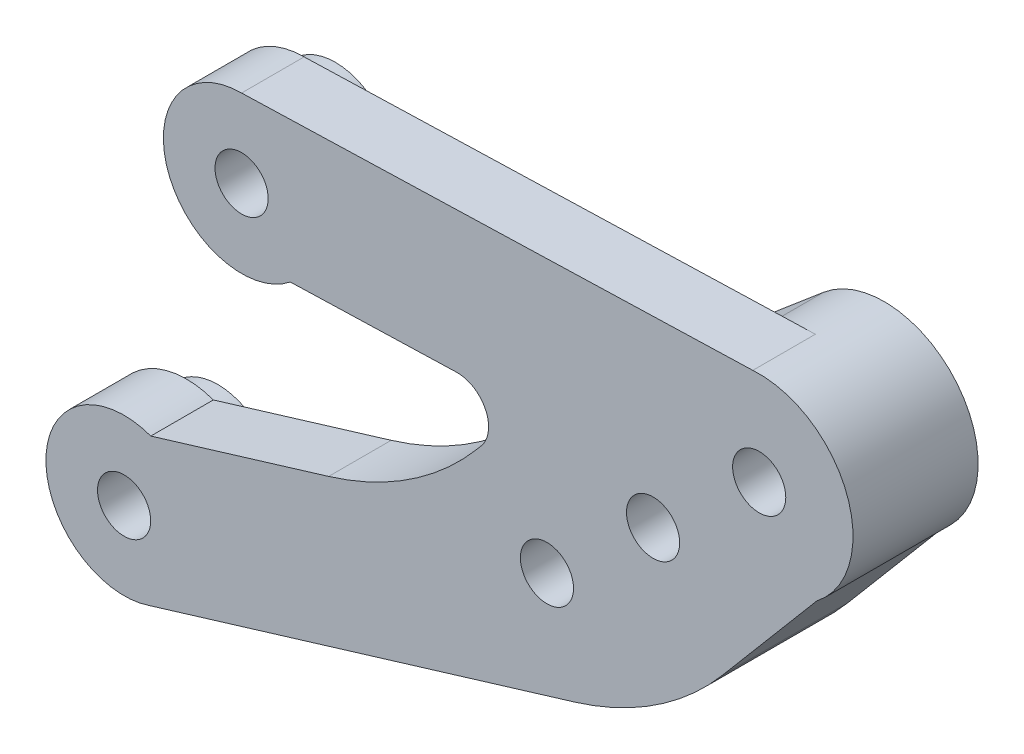
ISO-10303-21;
HEADER;
FILE_DESCRIPTION(('STEP AP214'),'2;1');
FILE_NAME('part.step','',(''),(''),'','','');
FILE_SCHEMA(('AUTOMOTIVE_DESIGN { 1 0 10303 214 1 1 1 1 }'));
ENDSEC;
DATA;
#1=APPLICATION_CONTEXT('core data for automotive mechanical design processes');
#2=APPLICATION_PROTOCOL_DEFINITION('international standard','automotive_design',2000,#1);
#3=PRODUCT_CONTEXT('',#1,'mechanical');
#4=PRODUCT('Part','Part','',(#3));
#5=PRODUCT_RELATED_PRODUCT_CATEGORY('part','',(#4));
#6=PRODUCT_DEFINITION_FORMATION('','',#4);
#7=PRODUCT_DEFINITION_CONTEXT('part definition',#1,'design');
#8=PRODUCT_DEFINITION('design','',#6,#7);
#9=PRODUCT_DEFINITION_SHAPE('','',#8);
#10=(LENGTH_UNIT() NAMED_UNIT(*) SI_UNIT(.MILLI.,.METRE.));
#11=(NAMED_UNIT(*) PLANE_ANGLE_UNIT() SI_UNIT($,.RADIAN.));
#12=(NAMED_UNIT(*) SI_UNIT($,.STERADIAN.) SOLID_ANGLE_UNIT());
#13=UNCERTAINTY_MEASURE_WITH_UNIT(LENGTH_MEASURE(1.E-05),#10,'distance_accuracy_value','');
#14=(GEOMETRIC_REPRESENTATION_CONTEXT(3) GLOBAL_UNCERTAINTY_ASSIGNED_CONTEXT((#13)) GLOBAL_UNIT_ASSIGNED_CONTEXT((#10,
#11,#12)) REPRESENTATION_CONTEXT('',''));
#15=CARTESIAN_POINT('',(0.,0.,0.));
#16=DIRECTION('',(0.,0.,1.));
#17=DIRECTION('',(1.,0.,0.));
#18=AXIS2_PLACEMENT_3D('',#15,#16,#17);
#19=CARTESIAN_POINT('',(0.,0.,-2.));
#20=DIRECTION('',(0.,0.,1.));
#21=DIRECTION('',(1.,0.,0.));
#22=AXIS2_PLACEMENT_3D('',#19,#20,#21);
#23=PLANE('',#22);
#24=CARTESIAN_POINT('',(26.9360632309097,9.68603359319531,-2.));
#25=DIRECTION('',(0.,0.,-1.));
#26=DIRECTION('',(-1.,0.,0.));
#27=AXIS2_PLACEMENT_3D('',#24,#25,#26);
#28=CIRCLE('',#27,6.44539896497374);
#29=CARTESIAN_POINT('',(28.8076552815149,3.5183508019198,-2.));
#30=VERTEX_POINT('',#29);
#31=CARTESIAN_POINT('',(21.6839891931415,13.4221928670333,-2.));
#32=VERTEX_POINT('',#31);
#33=EDGE_CURVE('E179',#30,#32,#28,.T.);
#34=ORIENTED_EDGE('',*,*,#33,.F.);
#35=DIRECTION('',(0.956912492894943,0.290376446947038,0.));
#36=VECTOR('',#35,1.);
#37=CARTESIAN_POINT('',(1.45139171596717,-4.78294599887616,-2.));
#38=LINE('',#37,#36);
#39=CARTESIAN_POINT('',(1.57575227360064,-4.74520861208887,-2.));
#40=VERTEX_POINT('',#39);
#41=EDGE_CURVE('E273',#40,#30,#38,.T.);
#42=ORIENTED_EDGE('',*,*,#41,.F.);
#43=CARTESIAN_POINT('',(0.,0.,-2.));
#44=DIRECTION('',(0.,0.,1.));
#45=DIRECTION('',(1.,0.,0.));
#46=AXIS2_PLACEMENT_3D('',#43,#44,#45);
#47=CIRCLE('',#46,5.);
#48=CARTESIAN_POINT('',(1.70658461953951,4.69974136909162,-2.));
#49=VERTEX_POINT('',#48);
#50=EDGE_CURVE('E269',#49,#40,#47,.T.);
#51=ORIENTED_EDGE('',*,*,#50,.F.);
#52=DIRECTION('',(-0.956912492894943,-0.290376446947038,0.));
#53=VECTOR('',#52,1.);
#54=CARTESIAN_POINT('',(-1.16199630655618,3.82926643717832,-2.));
#55=LINE('',#54,#53);
#56=CARTESIAN_POINT('',(13.0793967045248,8.15083725252361,-2.));
#57=VERTEX_POINT('',#56);
#58=EDGE_CURVE('E266',#57,#49,#55,.T.);
#59=ORIENTED_EDGE('',*,*,#58,.F.);
#60=CARTESIAN_POINT('',(7.27186776558407,27.2890871104225,-2.));
#61=DIRECTION('',(0.,0.,1.));
#62=DIRECTION('',(1.,0.,0.));
#63=AXIS2_PLACEMENT_3D('',#60,#61,#62);
#64=CIRCLE('',#63,20.);
#65=EDGE_CURVE('E311',#57,#32,#64,.T.);
#66=ORIENTED_EDGE('',*,*,#65,.T.);
#67=EDGE_LOOP('',(#34,#42,#51,#59,#66));
#68=FACE_BOUND('',#67,.T.);
#69=CARTESIAN_POINT('',(0.,0.,-2.));
#70=DIRECTION('',(0.,0.,1.));
#71=DIRECTION('',(1.,0.,0.));
#72=AXIS2_PLACEMENT_3D('',#69,#70,#71);
#73=CIRCLE('',#72,3.7);
#74=CARTESIAN_POINT('',(3.7,0.,-2.));
#75=VERTEX_POINT('',#74);
#76=EDGE_CURVE('E318',#75,#75,#73,.F.);
#77=ORIENTED_EDGE('',*,*,#76,.F.);
#78=EDGE_LOOP('',(#77));
#79=FACE_BOUND('',#78,.T.);
#80=ADVANCED_FACE('F41',(#68,#79),#23,.F.);
#81=CARTESIAN_POINT('',(40.6128867069486,21.6007739057783,-2.));
#82=DIRECTION('',(0.,0.,-1.));
#83=DIRECTION('',(-1.,0.,0.));
#84=AXIS2_PLACEMENT_3D('',#81,#82,#83);
#85=CIRCLE('',#84,6.);
#86=CARTESIAN_POINT('',(36.7334177781984,26.1778604060383,-2.));
#87=VERTEX_POINT('',#86);
#88=CARTESIAN_POINT('',(40.203783053973,27.5868105078317,-2.));
#89=VERTEX_POINT('',#88);
#90=EDGE_CURVE('E193',#87,#89,#85,.T.);
#91=ORIENTED_EDGE('',*,*,#90,.F.);
#92=DIRECTION('',(0.762847733091093,0.646578174792329,0.));
#93=VECTOR('',#92,1.);
#94=CARTESIAN_POINT('',(36.7334177781984,26.1778604060383,-2.));
#95=LINE('',#94,#93);
#96=EDGE_CURVE('E175',#32,#87,#95,.T.);
#97=ORIENTED_EDGE('',*,*,#96,.F.);
#98=CARTESIAN_POINT('',(22.5414357724455,14.3724198590053,-2.));
#99=VERTEX_POINT('',#98);
#100=EDGE_CURVE('E310',#32,#99,#64,.T.);
#101=ORIENTED_EDGE('',*,*,#100,.T.);
#102=DIRECTION('',(-0.645833362570859,-0.763478400343073,0.));
#103=VECTOR('',#102,1.);
#104=CARTESIAN_POINT('',(6.0526361731001,-5.11998030374497,-2.));
#105=LINE('',#104,#103);
#106=CARTESIAN_POINT('',(22.8356424846143,14.7202192806435,-2.));
#107=VERTEX_POINT('',#106);
#108=EDGE_CURVE('E263',#107,#99,#105,.T.);
#109=ORIENTED_EDGE('',*,*,#108,.F.);
#110=CARTESIAN_POINT('',(21.3086856839282,16.0118860057853,-2.));
#111=DIRECTION('',(0.,0.,1.));
#112=DIRECTION('',(1.,0.,0.));
#113=AXIS2_PLACEMENT_3D('',#110,#111,#112);
#114=CIRCLE('',#113,2.);
#115=CARTESIAN_POINT('',(21.248388262694,18.0109768543943,-2.));
#116=VERTEX_POINT('',#115);
#117=EDGE_CURVE('E11',#107,#116,#114,.T.);
#118=ORIENTED_EDGE('',*,*,#117,.T.);
#119=DIRECTION('',(0.999545424304533,0.0301487106170736,0.));
#120=VECTOR('',#119,1.);
#121=CARTESIAN_POINT('',(-0.523447280000722,17.3542855691174,-2.));
#122=LINE('',#121,#120);
#123=CARTESIAN_POINT('',(10.6291548266564,17.6906750571438,-2.));
#124=VERTEX_POINT('',#123);
#125=EDGE_CURVE('E259',#124,#116,#122,.T.);
#126=ORIENTED_EDGE('',*,*,#125,.F.);
#127=CARTESIAN_POINT('',(7.51288670694863,21.6007739057783,-2.));
#128=DIRECTION('',(0.,0.,1.));
#129=DIRECTION('',(1.,0.,0.));
#130=AXIS2_PLACEMENT_3D('',#127,#128,#129);
#131=CIRCLE('',#130,5.);
#132=CARTESIAN_POINT('',(7.51288670694863,26.6007739057783,-2.));
#133=VERTEX_POINT('',#132);
#134=EDGE_CURVE('E255',#133,#124,#131,.T.);
#135=ORIENTED_EDGE('',*,*,#134,.F.);
#136=DIRECTION('',(0.999545424304533,0.0301487106170735,0.));
#137=VECTOR('',#136,1.);
#138=CARTESIAN_POINT('',(-0.794785675554382,26.3501943878582,-2.));
#139=LINE('',#138,#137);
#140=EDGE_CURVE('E252',#133,#89,#139,.T.);
#141=ORIENTED_EDGE('',*,*,#140,.T.);
#142=EDGE_LOOP('',(#91,#97,#101,#109,#118,#126,#135,#141));
#143=FACE_BOUND('',#142,.T.);
#144=CARTESIAN_POINT('',(7.51288670694863,21.6007739057783,-2.));
#145=DIRECTION('',(0.,0.,1.));
#146=DIRECTION('',(1.,0.,0.));
#147=AXIS2_PLACEMENT_3D('',#144,#145,#146);
#148=CIRCLE('',#147,3.7);
#149=CARTESIAN_POINT('',(11.2128867069486,21.6007739057783,-2.));
#150=VERTEX_POINT('',#149);
#151=EDGE_CURVE('E314',#150,#150,#148,.F.);
#152=ORIENTED_EDGE('',*,*,#151,.F.);
#153=EDGE_LOOP('',(#152));
#154=FACE_BOUND('',#153,.T.);
#155=ADVANCED_FACE('F334',(#143,#154),#23,.F.);
#156=CARTESIAN_POINT('',(-0.794785675554382,26.3501943878582,-2.));
#157=DIRECTION('',(0.0301487106170735,-0.999545424304533,0.));
#158=DIRECTION('',(0.999545424304533,0.0301487106170735,0.));
#159=AXIS2_PLACEMENT_3D('',#156,#157,#158);
#160=PLANE('',#159);
#161=DIRECTION('',(0.,0.,1.));
#162=VECTOR('',#161,1.);
#163=CARTESIAN_POINT('',(7.51288670694863,26.6007739057783,-2.));
#164=LINE('',#163,#162);
#165=CARTESIAN_POINT('',(7.51288670694863,26.6007739057783,2.));
#166=VERTEX_POINT('',#165);
#167=EDGE_CURVE('E277',#133,#166,#164,.T.);
#168=ORIENTED_EDGE('',*,*,#167,.T.);
#169=DIRECTION('',(0.999545424304533,0.0301487106170735,0.));
#170=VECTOR('',#169,1.);
#171=CARTESIAN_POINT('',(-0.794785675554382,26.3501943878582,2.));
#172=LINE('',#171,#170);
#173=CARTESIAN_POINT('',(40.203783053973,27.5868105078317,2.));
#174=VERTEX_POINT('',#173);
#175=EDGE_CURVE('E222',#166,#174,#172,.T.);
#176=ORIENTED_EDGE('',*,*,#175,.T.);
#177=DIRECTION('',(0.,0.,1.));
#178=VECTOR('',#177,1.);
#179=CARTESIAN_POINT('',(40.203783053973,27.5868105078317,-2.));
#180=LINE('',#179,#178);
#181=EDGE_CURVE('E156',#89,#174,#180,.T.);
#182=ORIENTED_EDGE('',*,*,#181,.F.);
#183=ORIENTED_EDGE('',*,*,#140,.F.);
#184=EDGE_LOOP('',(#168,#176,#182,#183));
#185=FACE_BOUND('',#184,.T.);
#186=ADVANCED_FACE('F357',(#185),#160,.F.);
#187=CARTESIAN_POINT('',(40.6128867069486,21.6007739057783,-2.));
#188=DIRECTION('',(0.,0.,1.));
#189=DIRECTION('',(1.,0.,0.));
#190=AXIS2_PLACEMENT_3D('',#187,#188,#189);
#191=CYLINDRICAL_SURFACE('',#190,6.);
#192=ORIENTED_EDGE('',*,*,#181,.T.);
#193=CARTESIAN_POINT('',(40.6128867069486,21.6007739057783,2.));
#194=DIRECTION('',(0.,0.,1.));
#195=DIRECTION('',(1.,0.,0.));
#196=AXIS2_PLACEMENT_3D('',#193,#194,#195);
#197=CIRCLE('',#196,6.);
#198=CARTESIAN_POINT('',(44.2966352413055,16.8647421559245,2.));
#199=VERTEX_POINT('',#198);
#200=EDGE_CURVE('E152',#199,#174,#197,.T.);
#201=ORIENTED_EDGE('',*,*,#200,.F.);
#202=DIRECTION('',(0.,0.,1.));
#203=VECTOR('',#202,1.);
#204=CARTESIAN_POINT('',(44.2966352413055,16.8647421559245,-2.));
#205=LINE('',#204,#203);
#206=CARTESIAN_POINT('',(44.2966352413055,16.8647421559245,-6.));
#207=VERTEX_POINT('',#206);
#208=EDGE_CURVE('E145',#207,#199,#205,.T.);
#209=ORIENTED_EDGE('',*,*,#208,.F.);
#210=CARTESIAN_POINT('',(40.6128867069486,21.6007739057783,-6.));
#211=DIRECTION('',(0.,0.,-1.));
#212=DIRECTION('',(-1.,0.,0.));
#213=AXIS2_PLACEMENT_3D('',#210,#211,#212);
#214=CIRCLE('',#213,6.);
#215=CARTESIAN_POINT('',(36.7334177781984,26.1778604060383,-6.));
#216=VERTEX_POINT('',#215);
#217=EDGE_CURVE('E150',#216,#207,#214,.T.);
#218=ORIENTED_EDGE('',*,*,#217,.F.);
#219=DIRECTION('',(0.,0.,1.));
#220=VECTOR('',#219,1.);
#221=CARTESIAN_POINT('',(36.7334177781984,26.1778604060383,-6.));
#222=LINE('',#221,#220);
#223=EDGE_CURVE('E192',#216,#87,#222,.T.);
#224=ORIENTED_EDGE('',*,*,#223,.T.);
#225=ORIENTED_EDGE('',*,*,#90,.T.);
#226=EDGE_LOOP('',(#192,#201,#209,#218,#224,#225));
#227=FACE_BOUND('',#226,.T.);
#228=ADVANCED_FACE('F147',(#227),#191,.T.);
#229=CARTESIAN_POINT('',(17.5048121782462,-14.8074807423079,-2.));
#230=DIRECTION('',(0.763478400343073,-0.645833362570859,0.));
#231=DIRECTION('',(0.645833362570859,0.763478400343073,0.));
#232=AXIS2_PLACEMENT_3D('',#229,#230,#231);
#233=PLANE('',#232);
#234=DIRECTION('',(0.645833362570859,0.763478400343073,0.));
#235=VECTOR('',#234,1.);
#236=CARTESIAN_POINT('',(17.5048121782462,-14.8074807423079,2.));
#237=LINE('',#236,#235);
#238=CARTESIAN_POINT('',(38.2696943494356,9.7399334084015,2.));
#239=VERTEX_POINT('',#238);
#240=EDGE_CURVE('E247',#239,#199,#237,.T.);
#241=ORIENTED_EDGE('',*,*,#240,.F.);
#242=DIRECTION('',(0.,0.,1.));
#243=VECTOR('',#242,1.);
#244=CARTESIAN_POINT('',(38.2696943494356,9.73993340840149,-2.));
#245=LINE('',#244,#243);
#246=CARTESIAN_POINT('',(38.2696943494356,9.7399334084015,-6.));
#247=VERTEX_POINT('',#246);
#248=EDGE_CURVE('E163',#239,#247,#245,.F.);
#249=ORIENTED_EDGE('',*,*,#248,.T.);
#250=DIRECTION('',(-0.645833362570859,-0.763478400343073,0.));
#251=VECTOR('',#250,1.);
#252=CARTESIAN_POINT('',(44.2966352413055,16.8647421559245,-6.));
#253=LINE('',#252,#251);
#254=EDGE_CURVE('E160',#207,#247,#253,.T.);
#255=ORIENTED_EDGE('',*,*,#254,.F.);
#256=ORIENTED_EDGE('',*,*,#208,.T.);
#257=EDGE_LOOP('',(#241,#249,#255,#256));
#258=FACE_BOUND('',#257,.T.);
#259=ADVANCED_FACE('F161',(#258),#233,.T.);
#260=CARTESIAN_POINT('',(1.45139171596717,-4.78294599887616,-2.));
#261=DIRECTION('',(0.290376446947038,-0.956912492894943,0.));
#262=DIRECTION('',(0.956912492894943,0.290376446947038,0.));
#263=AXIS2_PLACEMENT_3D('',#260,#261,#262);
#264=PLANE('',#263);
#265=ORIENTED_EDGE('',*,*,#41,.T.);
#266=DIRECTION('',(0.,0.,1.));
#267=VECTOR('',#266,1.);
#268=CARTESIAN_POINT('',(28.8076552815149,3.5183508019198,-2.));
#269=LINE('',#268,#267);
#270=CARTESIAN_POINT('',(28.8076552815149,3.5183508019198,2.));
#271=VERTEX_POINT('',#270);
#272=EDGE_CURVE('E298',#30,#271,#269,.T.);
#273=ORIENTED_EDGE('',*,*,#272,.T.);
#274=DIRECTION('',(0.956912492894943,0.290376446947038,0.));
#275=VECTOR('',#274,1.);
#276=CARTESIAN_POINT('',(1.45139171596717,-4.78294599887616,2.));
#277=LINE('',#276,#275);
#278=CARTESIAN_POINT('',(1.57575227360064,-4.74520861208887,2.));
#279=VERTEX_POINT('',#278);
#280=EDGE_CURVE('E243',#279,#271,#277,.T.);
#281=ORIENTED_EDGE('',*,*,#280,.F.);
#282=DIRECTION('',(0.,0.,1.));
#283=VECTOR('',#282,1.);
#284=CARTESIAN_POINT('',(1.57575227360064,-4.74520861208887,-2.));
#285=LINE('',#284,#283);
#286=EDGE_CURVE('E157',#40,#279,#285,.T.);
#287=ORIENTED_EDGE('',*,*,#286,.F.);
#288=EDGE_LOOP('',(#265,#273,#281,#287));
#289=FACE_BOUND('',#288,.T.);
#290=ADVANCED_FACE('F372',(#289),#264,.T.);
#291=CARTESIAN_POINT('',(0.,0.,-2.));
#292=DIRECTION('',(0.,0.,1.));
#293=DIRECTION('',(1.,0.,0.));
#294=AXIS2_PLACEMENT_3D('',#291,#292,#293);
#295=CYLINDRICAL_SURFACE('',#294,5.);
#296=ORIENTED_EDGE('',*,*,#286,.T.);
#297=CARTESIAN_POINT('',(0.,0.,2.));
#298=DIRECTION('',(0.,0.,1.));
#299=DIRECTION('',(1.,0.,0.));
#300=AXIS2_PLACEMENT_3D('',#297,#298,#299);
#301=CIRCLE('',#300,5.);
#302=CARTESIAN_POINT('',(1.70658461953951,4.69974136909162,2.));
#303=VERTEX_POINT('',#302);
#304=EDGE_CURVE('E239',#303,#279,#301,.T.);
#305=ORIENTED_EDGE('',*,*,#304,.F.);
#306=DIRECTION('',(0.,0.,1.));
#307=VECTOR('',#306,1.);
#308=CARTESIAN_POINT('',(1.70658461953951,4.69974136909162,-2.));
#309=LINE('',#308,#307);
#310=EDGE_CURVE('E283',#49,#303,#309,.T.);
#311=ORIENTED_EDGE('',*,*,#310,.F.);
#312=ORIENTED_EDGE('',*,*,#50,.T.);
#313=EDGE_LOOP('',(#296,#305,#311,#312));
#314=FACE_BOUND('',#313,.T.);
#315=ADVANCED_FACE('F381',(#314),#295,.T.);
#316=CARTESIAN_POINT('',(-1.16199630655618,3.82926643717832,-2.));
#317=DIRECTION('',(-0.290376446947038,0.956912492894943,0.));
#318=DIRECTION('',(-0.956912492894943,-0.290376446947038,0.));
#319=AXIS2_PLACEMENT_3D('',#316,#317,#318);
#320=PLANE('',#319);
#321=DIRECTION('',(-0.956912492894943,-0.290376446947038,0.));
#322=VECTOR('',#321,1.);
#323=CARTESIAN_POINT('',(-1.16199630655618,3.82926643717832,2.));
#324=LINE('',#323,#322);
#325=CARTESIAN_POINT('',(13.0793967045248,8.15083725252361,2.));
#326=VERTEX_POINT('',#325);
#327=EDGE_CURVE('E236',#326,#303,#324,.T.);
#328=ORIENTED_EDGE('',*,*,#327,.F.);
#329=DIRECTION('',(0.,0.,1.));
#330=VECTOR('',#329,1.);
#331=CARTESIAN_POINT('',(13.0793967045248,8.15083725252361,-2.));
#332=LINE('',#331,#330);
#333=EDGE_CURVE('E295',#326,#57,#332,.F.);
#334=ORIENTED_EDGE('',*,*,#333,.T.);
#335=ORIENTED_EDGE('',*,*,#58,.T.);
#336=ORIENTED_EDGE('',*,*,#310,.T.);
#337=EDGE_LOOP('',(#328,#334,#335,#336));
#338=FACE_BOUND('',#337,.T.);
#339=ADVANCED_FACE('F383',(#338),#320,.T.);
#340=CARTESIAN_POINT('',(6.0526361731001,-5.11998030374497,-2.));
#341=DIRECTION('',(-0.763478400343073,0.645833362570859,0.));
#342=DIRECTION('',(-0.645833362570859,-0.763478400343073,0.));
#343=AXIS2_PLACEMENT_3D('',#340,#341,#342);
#344=PLANE('',#343);
#345=DIRECTION('',(-0.645833362570859,-0.763478400343073,0.));
#346=VECTOR('',#345,1.);
#347=CARTESIAN_POINT('',(6.0526361731001,-5.11998030374497,2.));
#348=LINE('',#347,#346);
#349=CARTESIAN_POINT('',(22.8356424846143,14.7202192806435,2.));
#350=VERTEX_POINT('',#349);
#351=CARTESIAN_POINT('',(22.5414357724455,14.3724198590053,2.));
#352=VERTEX_POINT('',#351);
#353=EDGE_CURVE('E233',#350,#352,#348,.T.);
#354=ORIENTED_EDGE('',*,*,#353,.F.);
#355=DIRECTION('',(0.,0.,1.));
#356=VECTOR('',#355,1.);
#357=CARTESIAN_POINT('',(22.8356424846143,14.7202192806435,-2.));
#358=LINE('',#357,#356);
#359=EDGE_CURVE('E63',#350,#107,#358,.F.);
#360=ORIENTED_EDGE('',*,*,#359,.T.);
#361=ORIENTED_EDGE('',*,*,#108,.T.);
#362=DIRECTION('',(0.,0.,1.));
#363=VECTOR('',#362,1.);
#364=CARTESIAN_POINT('',(22.5414357724455,14.3724198590053,2.));
#365=LINE('',#364,#363);
#366=EDGE_CURVE('E279',#99,#352,#365,.T.);
#367=ORIENTED_EDGE('',*,*,#366,.T.);
#368=EDGE_LOOP('',(#354,#360,#361,#367));
#369=FACE_BOUND('',#368,.T.);
#370=ADVANCED_FACE('F342',(#369),#344,.T.);
#371=CARTESIAN_POINT('',(-0.523447280000722,17.3542855691174,-2.));
#372=DIRECTION('',(0.0301487106170736,-0.999545424304533,0.));
#373=DIRECTION('',(0.999545424304533,0.0301487106170736,0.));
#374=AXIS2_PLACEMENT_3D('',#371,#372,#373);
#375=PLANE('',#374);
#376=ORIENTED_EDGE('',*,*,#125,.T.);
#377=DIRECTION('',(0.,0.,1.));
#378=VECTOR('',#377,1.);
#379=CARTESIAN_POINT('',(21.248388262694,18.0109768543943,2.));
#380=LINE('',#379,#378);
#381=CARTESIAN_POINT('',(21.248388262694,18.0109768543943,2.));
#382=VERTEX_POINT('',#381);
#383=EDGE_CURVE('E322',#116,#382,#380,.T.);
#384=ORIENTED_EDGE('',*,*,#383,.T.);
#385=DIRECTION('',(0.999545424304533,0.0301487106170736,0.));
#386=VECTOR('',#385,1.);
#387=CARTESIAN_POINT('',(-0.523447280000722,17.3542855691174,2.));
#388=LINE('',#387,#386);
#389=CARTESIAN_POINT('',(10.6291548266564,17.6906750571438,2.));
#390=VERTEX_POINT('',#389);
#391=EDGE_CURVE('E230',#390,#382,#388,.T.);
#392=ORIENTED_EDGE('',*,*,#391,.F.);
#393=DIRECTION('',(0.,0.,1.));
#394=VECTOR('',#393,1.);
#395=CARTESIAN_POINT('',(10.6291548266564,17.6906750571438,-2.));
#396=LINE('',#395,#394);
#397=EDGE_CURVE('E287',#124,#390,#396,.T.);
#398=ORIENTED_EDGE('',*,*,#397,.F.);
#399=EDGE_LOOP('',(#376,#384,#392,#398));
#400=FACE_BOUND('',#399,.T.);
#401=ADVANCED_FACE('F348',(#400),#375,.T.);
#402=CARTESIAN_POINT('',(7.51288670694863,21.6007739057783,-2.));
#403=DIRECTION('',(0.,0.,1.));
#404=DIRECTION('',(1.,0.,0.));
#405=AXIS2_PLACEMENT_3D('',#402,#403,#404);
#406=CYLINDRICAL_SURFACE('',#405,1.7);
#407=CARTESIAN_POINT('',(7.51288670694863,21.6007739057783,2.));
#408=DIRECTION('',(0.,0.,1.));
#409=DIRECTION('',(1.,0.,0.));
#410=AXIS2_PLACEMENT_3D('',#407,#408,#409);
#411=CIRCLE('',#410,1.7);
#412=CARTESIAN_POINT('',(9.21288670694863,21.6007739057783,2.));
#413=VERTEX_POINT('',#412);
#414=EDGE_CURVE('E218',#413,#413,#411,.T.);
#415=ORIENTED_EDGE('',*,*,#414,.T.);
#416=EDGE_LOOP('',(#415));
#417=FACE_BOUND('',#416,.T.);
#418=CARTESIAN_POINT('',(7.51288670694863,21.6007739057783,-4.));
#419=DIRECTION('',(0.,0.,-1.));
#420=DIRECTION('',(-1.,0.,0.));
#421=AXIS2_PLACEMENT_3D('',#418,#419,#420);
#422=CIRCLE('',#421,1.7);
#423=CARTESIAN_POINT('',(5.81288670694863,21.6007739057783,-4.));
#424=VERTEX_POINT('',#423);
#425=EDGE_CURVE('E633',#424,#424,#422,.T.);
#426=ORIENTED_EDGE('',*,*,#425,.T.);
#427=EDGE_LOOP('',(#426));
#428=FACE_BOUND('',#427,.T.);
#429=ADVANCED_FACE('F466',(#417,#428),#406,.F.);
#430=CARTESIAN_POINT('',(40.6128867069486,21.6007739057783,-2.));
#431=DIRECTION('',(0.,0.,1.));
#432=DIRECTION('',(1.,0.,0.));
#433=AXIS2_PLACEMENT_3D('',#430,#431,#432);
#434=CYLINDRICAL_SURFACE('',#433,1.7);
#435=CARTESIAN_POINT('',(40.6128867069486,21.6007739057783,2.));
#436=DIRECTION('',(0.,0.,1.));
#437=DIRECTION('',(1.,0.,0.));
#438=AXIS2_PLACEMENT_3D('',#435,#436,#437);
#439=CIRCLE('',#438,1.7);
#440=CARTESIAN_POINT('',(42.3128867069486,21.6007739057783,2.));
#441=VERTEX_POINT('',#440);
#442=EDGE_CURVE('E214',#441,#441,#439,.T.);
#443=ORIENTED_EDGE('',*,*,#442,.T.);
#444=EDGE_LOOP('',(#443));
#445=FACE_BOUND('',#444,.T.);
#446=CARTESIAN_POINT('',(40.6128867069486,21.6007739057783,-6.));
#447=DIRECTION('',(0.,0.,-1.));
#448=DIRECTION('',(-1.,0.,0.));
#449=AXIS2_PLACEMENT_3D('',#446,#447,#448);
#450=CIRCLE('',#449,1.7);
#451=CARTESIAN_POINT('',(38.9128867069486,21.6007739057783,-6.));
#452=VERTEX_POINT('',#451);
#453=EDGE_CURVE('E182',#452,#452,#450,.T.);
#454=ORIENTED_EDGE('',*,*,#453,.T.);
#455=EDGE_LOOP('',(#454));
#456=FACE_BOUND('',#455,.T.);
#457=ADVANCED_FACE('F460',(#445,#456),#434,.F.);
#458=CARTESIAN_POINT('',(0.,0.,-2.));
#459=DIRECTION('',(0.,0.,1.));
#460=DIRECTION('',(1.,0.,0.));
#461=AXIS2_PLACEMENT_3D('',#458,#459,#460);
#462=CYLINDRICAL_SURFACE('',#461,1.7);
#463=CARTESIAN_POINT('',(0.,0.,2.));
#464=DIRECTION('',(0.,0.,1.));
#465=DIRECTION('',(1.,0.,0.));
#466=AXIS2_PLACEMENT_3D('',#463,#464,#465);
#467=CIRCLE('',#466,1.7);
#468=CARTESIAN_POINT('',(1.7,0.,2.));
#469=VERTEX_POINT('',#468);
#470=EDGE_CURVE('E210',#469,#469,#467,.T.);
#471=ORIENTED_EDGE('',*,*,#470,.T.);
#472=EDGE_LOOP('',(#471));
#473=FACE_BOUND('',#472,.T.);
#474=CARTESIAN_POINT('',(0.,0.,-4.));
#475=DIRECTION('',(0.,0.,-1.));
#476=DIRECTION('',(-1.,0.,0.));
#477=AXIS2_PLACEMENT_3D('',#474,#475,#476);
#478=CIRCLE('',#477,1.7);
#479=CARTESIAN_POINT('',(-1.7,0.,-4.));
#480=VERTEX_POINT('',#479);
#481=EDGE_CURVE('E643',#480,#480,#478,.T.);
#482=ORIENTED_EDGE('',*,*,#481,.T.);
#483=EDGE_LOOP('',(#482));
#484=FACE_BOUND('',#483,.T.);
#485=ADVANCED_FACE('F423',(#473,#484),#462,.F.);
#486=CARTESIAN_POINT('',(7.51288670694863,21.6007739057783,-2.));
#487=DIRECTION('',(0.,0.,1.));
#488=DIRECTION('',(1.,0.,0.));
#489=AXIS2_PLACEMENT_3D('',#486,#487,#488);
#490=CYLINDRICAL_SURFACE('',#489,5.);
#491=ORIENTED_EDGE('',*,*,#397,.T.);
#492=CARTESIAN_POINT('',(7.51288670694863,21.6007739057783,2.));
#493=DIRECTION('',(0.,0.,1.));
#494=DIRECTION('',(1.,0.,0.));
#495=AXIS2_PLACEMENT_3D('',#492,#493,#494);
#496=CIRCLE('',#495,5.);
#497=EDGE_CURVE('E226',#166,#390,#496,.T.);
#498=ORIENTED_EDGE('',*,*,#497,.F.);
#499=ORIENTED_EDGE('',*,*,#167,.F.);
#500=ORIENTED_EDGE('',*,*,#134,.T.);
#501=EDGE_LOOP('',(#491,#498,#499,#500));
#502=FACE_BOUND('',#501,.T.);
#503=ADVANCED_FACE('F352',(#502),#490,.T.);
#504=CARTESIAN_POINT('',(0.,0.,2.));
#505=DIRECTION('',(0.,0.,1.));
#506=DIRECTION('',(1.,0.,0.));
#507=AXIS2_PLACEMENT_3D('',#504,#505,#506);
#508=PLANE('',#507);
#509=CARTESIAN_POINT('',(33.8268080769554,15.6889944082371,2.));
#510=DIRECTION('',(0.,0.,-1.));
#511=DIRECTION('',(-1.,0.,0.));
#512=AXIS2_PLACEMENT_3D('',#509,#510,#511);
#513=CIRCLE('',#512,1.7);
#514=CARTESIAN_POINT('',(32.1268080769554,15.6889944082371,2.));
#515=VERTEX_POINT('',#514);
#516=EDGE_CURVE('E620',#515,#515,#513,.T.);
#517=ORIENTED_EDGE('',*,*,#516,.T.);
#518=EDGE_LOOP('',(#517));
#519=FACE_BOUND('',#518,.T.);
#520=CARTESIAN_POINT('',(27.0407294469622,9.77721491069576,2.));
#521=DIRECTION('',(0.,0.,-1.));
#522=DIRECTION('',(-1.,0.,0.));
#523=AXIS2_PLACEMENT_3D('',#520,#521,#522);
#524=CIRCLE('',#523,1.7);
#525=CARTESIAN_POINT('',(25.3407294469622,9.77721491069576,2.));
#526=VERTEX_POINT('',#525);
#527=EDGE_CURVE('E624',#526,#526,#524,.T.);
#528=ORIENTED_EDGE('',*,*,#527,.T.);
#529=EDGE_LOOP('',(#528));
#530=FACE_BOUND('',#529,.T.);
#531=ORIENTED_EDGE('',*,*,#470,.F.);
#532=EDGE_LOOP('',(#531));
#533=FACE_BOUND('',#532,.T.);
#534=ORIENTED_EDGE('',*,*,#442,.F.);
#535=EDGE_LOOP('',(#534));
#536=FACE_BOUND('',#535,.T.);
#537=ORIENTED_EDGE('',*,*,#414,.F.);
#538=EDGE_LOOP('',(#537));
#539=FACE_BOUND('',#538,.T.);
#540=ORIENTED_EDGE('',*,*,#280,.T.);
#541=CARTESIAN_POINT('',(23.0001263425741,22.6566006598187,2.));
#542=DIRECTION('',(0.,0.,1.));
#543=DIRECTION('',(1.,0.,0.));
#544=AXIS2_PLACEMENT_3D('',#541,#542,#543);
#545=CIRCLE('',#544,20.);
#546=EDGE_CURVE('E302',#271,#239,#545,.T.);
#547=ORIENTED_EDGE('',*,*,#546,.T.);
#548=ORIENTED_EDGE('',*,*,#240,.T.);
#549=ORIENTED_EDGE('',*,*,#200,.T.);
#550=ORIENTED_EDGE('',*,*,#175,.F.);
#551=ORIENTED_EDGE('',*,*,#497,.T.);
#552=ORIENTED_EDGE('',*,*,#391,.T.);
#553=CARTESIAN_POINT('',(21.3086856839282,16.0118860057853,2.));
#554=DIRECTION('',(0.,0.,1.));
#555=DIRECTION('',(1.,0.,0.));
#556=AXIS2_PLACEMENT_3D('',#553,#554,#555);
#557=CIRCLE('',#556,2.);
#558=EDGE_CURVE('E50',#382,#350,#557,.F.);
#559=ORIENTED_EDGE('',*,*,#558,.T.);
#560=ORIENTED_EDGE('',*,*,#353,.T.);
#561=CARTESIAN_POINT('',(7.27186776558407,27.2890871104225,2.));
#562=DIRECTION('',(0.,0.,1.));
#563=DIRECTION('',(1.,0.,0.));
#564=AXIS2_PLACEMENT_3D('',#561,#562,#563);
#565=CIRCLE('',#564,20.);
#566=EDGE_CURVE('E307',#352,#326,#565,.F.);
#567=ORIENTED_EDGE('',*,*,#566,.T.);
#568=ORIENTED_EDGE('',*,*,#327,.T.);
#569=ORIENTED_EDGE('',*,*,#304,.T.);
#570=EDGE_LOOP('',(#540,#547,#548,#549,#550,#551,#552,#559,#560,#567,#568,#569));
#571=FACE_BOUND('',#570,.T.);
#572=ADVANCED_FACE('F376',(#519,#530,#533,#536,#539,#571),#508,.T.);
#573=CARTESIAN_POINT('',(7.27186776558407,27.2890871104225,-2.));
#574=DIRECTION('',(0.,0.,-1.));
#575=DIRECTION('',(-1.,0.,0.));
#576=AXIS2_PLACEMENT_3D('',#573,#574,#575);
#577=CYLINDRICAL_SURFACE('',#576,20.);
#578=ORIENTED_EDGE('',*,*,#65,.F.);
#579=ORIENTED_EDGE('',*,*,#333,.F.);
#580=ORIENTED_EDGE('',*,*,#566,.F.);
#581=ORIENTED_EDGE('',*,*,#366,.F.);
#582=ORIENTED_EDGE('',*,*,#100,.F.);
#583=EDGE_LOOP('',(#578,#579,#580,#581,#582));
#584=FACE_BOUND('',#583,.T.);
#585=ADVANCED_FACE('F340',(#584),#577,.F.);
#586=CARTESIAN_POINT('',(23.0001263425741,22.6566006598187,-2.));
#587=DIRECTION('',(0.,0.,1.));
#588=DIRECTION('',(1.,0.,0.));
#589=AXIS2_PLACEMENT_3D('',#586,#587,#588);
#590=CYLINDRICAL_SURFACE('',#589,20.);
#591=ORIENTED_EDGE('',*,*,#272,.F.);
#592=DIRECTION('',(0.,0.,1.));
#593=VECTOR('',#592,1.);
#594=CARTESIAN_POINT('',(28.8076552815149,3.5183508019198,-6.));
#595=LINE('',#594,#593);
#596=CARTESIAN_POINT('',(28.8076552815149,3.5183508019198,-6.));
#597=VERTEX_POINT('',#596);
#598=EDGE_CURVE('E206',#597,#30,#595,.T.);
#599=ORIENTED_EDGE('',*,*,#598,.F.);
#600=CARTESIAN_POINT('',(23.0001263425741,22.6566006598188,-6.));
#601=DIRECTION('',(0.,0.,-1.));
#602=DIRECTION('',(-1.,0.,0.));
#603=AXIS2_PLACEMENT_3D('',#600,#601,#602);
#604=CIRCLE('',#603,20.0000000000001);
#605=EDGE_CURVE('E167',#247,#597,#604,.T.);
#606=ORIENTED_EDGE('',*,*,#605,.F.);
#607=ORIENTED_EDGE('',*,*,#248,.F.);
#608=ORIENTED_EDGE('',*,*,#546,.F.);
#609=EDGE_LOOP('',(#591,#599,#606,#607,#608));
#610=FACE_BOUND('',#609,.T.);
#611=ADVANCED_FACE('F375',(#610),#590,.T.);
#612=CARTESIAN_POINT('',(40.6128867069486,21.6007739057783,-6.));
#613=DIRECTION('',(0.,0.,-1.));
#614=DIRECTION('',(-1.,0.,0.));
#615=AXIS2_PLACEMENT_3D('',#612,#613,#614);
#616=PLANE('',#615);
#617=CARTESIAN_POINT('',(33.8268080769554,15.6889944082371,-6.));
#618=DIRECTION('',(0.,0.,-1.));
#619=DIRECTION('',(-1.,0.,0.));
#620=AXIS2_PLACEMENT_3D('',#617,#618,#619);
#621=CIRCLE('',#620,1.7);
#622=CARTESIAN_POINT('',(32.1268080769554,15.6889944082371,-6.));
#623=VERTEX_POINT('',#622);
#624=EDGE_CURVE('E655',#623,#623,#621,.T.);
#625=ORIENTED_EDGE('',*,*,#624,.F.);
#626=EDGE_LOOP('',(#625));
#627=FACE_BOUND('',#626,.T.);
#628=CARTESIAN_POINT('',(27.0407294469622,9.77721491069576,-6.));
#629=DIRECTION('',(0.,0.,-1.));
#630=DIRECTION('',(-1.,0.,0.));
#631=AXIS2_PLACEMENT_3D('',#628,#629,#630);
#632=CIRCLE('',#631,1.7);
#633=CARTESIAN_POINT('',(25.3407294469622,9.77721491069576,-6.));
#634=VERTEX_POINT('',#633);
#635=EDGE_CURVE('E649',#634,#634,#632,.T.);
#636=ORIENTED_EDGE('',*,*,#635,.F.);
#637=EDGE_LOOP('',(#636));
#638=FACE_BOUND('',#637,.T.);
#639=ORIENTED_EDGE('',*,*,#217,.T.);
#640=ORIENTED_EDGE('',*,*,#254,.T.);
#641=ORIENTED_EDGE('',*,*,#605,.T.);
#642=CARTESIAN_POINT('',(26.9360632309097,9.68603359319531,-6.));
#643=DIRECTION('',(0.,0.,-1.));
#644=DIRECTION('',(-1.,0.,0.));
#645=AXIS2_PLACEMENT_3D('',#642,#643,#644);
#646=CIRCLE('',#645,6.44539896497374);
#647=CARTESIAN_POINT('',(21.6839891931415,13.4221928670333,-6.));
#648=VERTEX_POINT('',#647);
#649=EDGE_CURVE('E187',#597,#648,#646,.T.);
#650=ORIENTED_EDGE('',*,*,#649,.T.);
#651=DIRECTION('',(0.762847733091093,0.646578174792329,0.));
#652=VECTOR('',#651,1.);
#653=CARTESIAN_POINT('',(36.7334177781984,26.1778604060383,-6.));
#654=LINE('',#653,#652);
#655=EDGE_CURVE('E172',#648,#216,#654,.T.);
#656=ORIENTED_EDGE('',*,*,#655,.T.);
#657=EDGE_LOOP('',(#639,#640,#641,#650,#656));
#658=FACE_BOUND('',#657,.T.);
#659=ORIENTED_EDGE('',*,*,#453,.F.);
#660=EDGE_LOOP('',(#659));
#661=FACE_BOUND('',#660,.T.);
#662=ADVANCED_FACE('F169',(#627,#638,#658,#661),#616,.T.);
#663=CARTESIAN_POINT('',(26.9360632309097,9.68603359319531,-6.));
#664=DIRECTION('',(0.,0.,1.));
#665=DIRECTION('',(1.,0.,0.));
#666=AXIS2_PLACEMENT_3D('',#663,#664,#665);
#667=CYLINDRICAL_SURFACE('',#666,6.44539896497374);
#668=ORIENTED_EDGE('',*,*,#33,.T.);
#669=DIRECTION('',(0.,0.,1.));
#670=VECTOR('',#669,1.);
#671=CARTESIAN_POINT('',(21.6839891931415,13.4221928670333,-6.));
#672=LINE('',#671,#670);
#673=EDGE_CURVE('E202',#648,#32,#672,.T.);
#674=ORIENTED_EDGE('',*,*,#673,.F.);
#675=ORIENTED_EDGE('',*,*,#649,.F.);
#676=ORIENTED_EDGE('',*,*,#598,.T.);
#677=EDGE_LOOP('',(#668,#674,#675,#676));
#678=FACE_BOUND('',#677,.T.);
#679=ADVANCED_FACE('F363',(#678),#667,.T.);
#680=CARTESIAN_POINT('',(36.7334177781984,26.1778604060383,-6.));
#681=DIRECTION('',(0.646578174792329,-0.762847733091093,0.));
#682=DIRECTION('',(0.762847733091093,0.646578174792329,0.));
#683=AXIS2_PLACEMENT_3D('',#680,#681,#682);
#684=PLANE('',#683);
#685=ORIENTED_EDGE('',*,*,#96,.T.);
#686=ORIENTED_EDGE('',*,*,#223,.F.);
#687=ORIENTED_EDGE('',*,*,#655,.F.);
#688=ORIENTED_EDGE('',*,*,#673,.T.);
#689=EDGE_LOOP('',(#685,#686,#687,#688));
#690=FACE_BOUND('',#689,.T.);
#691=ADVANCED_FACE('F359',(#690),#684,.F.);
#692=CARTESIAN_POINT('',(7.51288670694863,21.6007739057783,-4.));
#693=DIRECTION('',(0.,0.,-1.));
#694=DIRECTION('',(-1.,0.,0.));
#695=AXIS2_PLACEMENT_3D('',#692,#693,#694);
#696=PLANE('',#695);
#697=CARTESIAN_POINT('',(7.51288670694863,21.6007739057783,-4.));
#698=DIRECTION('',(0.,0.,-1.));
#699=DIRECTION('',(-1.,0.,0.));
#700=AXIS2_PLACEMENT_3D('',#697,#698,#699);
#701=CIRCLE('',#700,3.7);
#702=CARTESIAN_POINT('',(3.81288670694863,21.6007739057783,-4.));
#703=VERTEX_POINT('',#702);
#704=EDGE_CURVE('E636',#703,#703,#701,.T.);
#705=ORIENTED_EDGE('',*,*,#704,.T.);
#706=EDGE_LOOP('',(#705));
#707=FACE_BOUND('',#706,.T.);
#708=ORIENTED_EDGE('',*,*,#425,.F.);
#709=EDGE_LOOP('',(#708));
#710=FACE_BOUND('',#709,.T.);
#711=ADVANCED_FACE('F504',(#707,#710),#696,.T.);
#712=CARTESIAN_POINT('',(7.51288670694863,21.6007739057783,-4.));
#713=DIRECTION('',(0.,0.,1.));
#714=DIRECTION('',(1.,0.,0.));
#715=AXIS2_PLACEMENT_3D('',#712,#713,#714);
#716=CYLINDRICAL_SURFACE('',#715,3.7);
#717=ORIENTED_EDGE('',*,*,#704,.F.);
#718=EDGE_LOOP('',(#717));
#719=FACE_BOUND('',#718,.T.);
#720=ORIENTED_EDGE('',*,*,#151,.T.);
#721=EDGE_LOOP('',(#720));
#722=FACE_BOUND('',#721,.T.);
#723=ADVANCED_FACE('F543',(#719,#722),#716,.T.);
#724=CARTESIAN_POINT('',(0.,0.,-4.));
#725=DIRECTION('',(0.,0.,-1.));
#726=DIRECTION('',(-1.,0.,0.));
#727=AXIS2_PLACEMENT_3D('',#724,#725,#726);
#728=PLANE('',#727);
#729=CARTESIAN_POINT('',(0.,0.,-4.));
#730=DIRECTION('',(0.,0.,-1.));
#731=DIRECTION('',(-1.,0.,0.));
#732=AXIS2_PLACEMENT_3D('',#729,#730,#731);
#733=CIRCLE('',#732,3.7);
#734=CARTESIAN_POINT('',(-3.7,0.,-4.));
#735=VERTEX_POINT('',#734);
#736=EDGE_CURVE('E637',#735,#735,#733,.T.);
#737=ORIENTED_EDGE('',*,*,#736,.T.);
#738=EDGE_LOOP('',(#737));
#739=FACE_BOUND('',#738,.T.);
#740=ORIENTED_EDGE('',*,*,#481,.F.);
#741=EDGE_LOOP('',(#740));
#742=FACE_BOUND('',#741,.T.);
#743=ADVANCED_FACE('F552',(#739,#742),#728,.T.);
#744=CARTESIAN_POINT('',(0.,0.,-4.));
#745=DIRECTION('',(0.,0.,1.));
#746=DIRECTION('',(1.,0.,0.));
#747=AXIS2_PLACEMENT_3D('',#744,#745,#746);
#748=CYLINDRICAL_SURFACE('',#747,3.7);
#749=ORIENTED_EDGE('',*,*,#736,.F.);
#750=EDGE_LOOP('',(#749));
#751=FACE_BOUND('',#750,.T.);
#752=ORIENTED_EDGE('',*,*,#76,.T.);
#753=EDGE_LOOP('',(#752));
#754=FACE_BOUND('',#753,.T.);
#755=ADVANCED_FACE('F561',(#751,#754),#748,.T.);
#756=CARTESIAN_POINT('',(21.3086856839282,16.0118860057853,-2.));
#757=DIRECTION('',(0.,0.,-1.));
#758=DIRECTION('',(-1.,0.,0.));
#759=AXIS2_PLACEMENT_3D('',#756,#757,#758);
#760=CYLINDRICAL_SURFACE('',#759,2.);
#761=ORIENTED_EDGE('',*,*,#117,.F.);
#762=ORIENTED_EDGE('',*,*,#359,.F.);
#763=ORIENTED_EDGE('',*,*,#558,.F.);
#764=ORIENTED_EDGE('',*,*,#383,.F.);
#765=EDGE_LOOP('',(#761,#762,#763,#764));
#766=FACE_BOUND('',#765,.T.);
#767=ADVANCED_FACE('F43',(#766),#760,.F.);
#768=CARTESIAN_POINT('',(27.0407294469622,9.77721491069576,2.));
#769=DIRECTION('',(0.,0.,-1.));
#770=DIRECTION('',(-1.,0.,0.));
#771=AXIS2_PLACEMENT_3D('',#768,#769,#770);
#772=CYLINDRICAL_SURFACE('',#771,1.7);
#773=ORIENTED_EDGE('',*,*,#527,.F.);
#774=EDGE_LOOP('',(#773));
#775=FACE_BOUND('',#774,.T.);
#776=ORIENTED_EDGE('',*,*,#635,.T.);
#777=EDGE_LOOP('',(#776));
#778=FACE_BOUND('',#777,.T.);
#779=ADVANCED_FACE('F577',(#775,#778),#772,.F.);
#780=CARTESIAN_POINT('',(33.8268080769554,15.6889944082371,2.));
#781=DIRECTION('',(0.,0.,-1.));
#782=DIRECTION('',(-1.,0.,0.));
#783=AXIS2_PLACEMENT_3D('',#780,#781,#782);
#784=CYLINDRICAL_SURFACE('',#783,1.7);
#785=ORIENTED_EDGE('',*,*,#516,.F.);
#786=EDGE_LOOP('',(#785));
#787=FACE_BOUND('',#786,.T.);
#788=ORIENTED_EDGE('',*,*,#624,.T.);
#789=EDGE_LOOP('',(#788));
#790=FACE_BOUND('',#789,.T.);
#791=ADVANCED_FACE('F584',(#787,#790),#784,.F.);
#792=CLOSED_SHELL('',(#80,#155,#186,#228,#259,#290,#315,#339,#370,#401,#429,#457,#485,#503,#572,
#585,#611,#662,#679,#691,#711,#723,#743,#755,#767,#779,#791));
#793=MANIFOLD_SOLID_BREP('B2',#792);
#794=ADVANCED_BREP_SHAPE_REPRESENTATION('',(#18,#793),#14);
#795=SHAPE_DEFINITION_REPRESENTATION(#9,#794);
ENDSEC;
END-ISO-10303-21;
